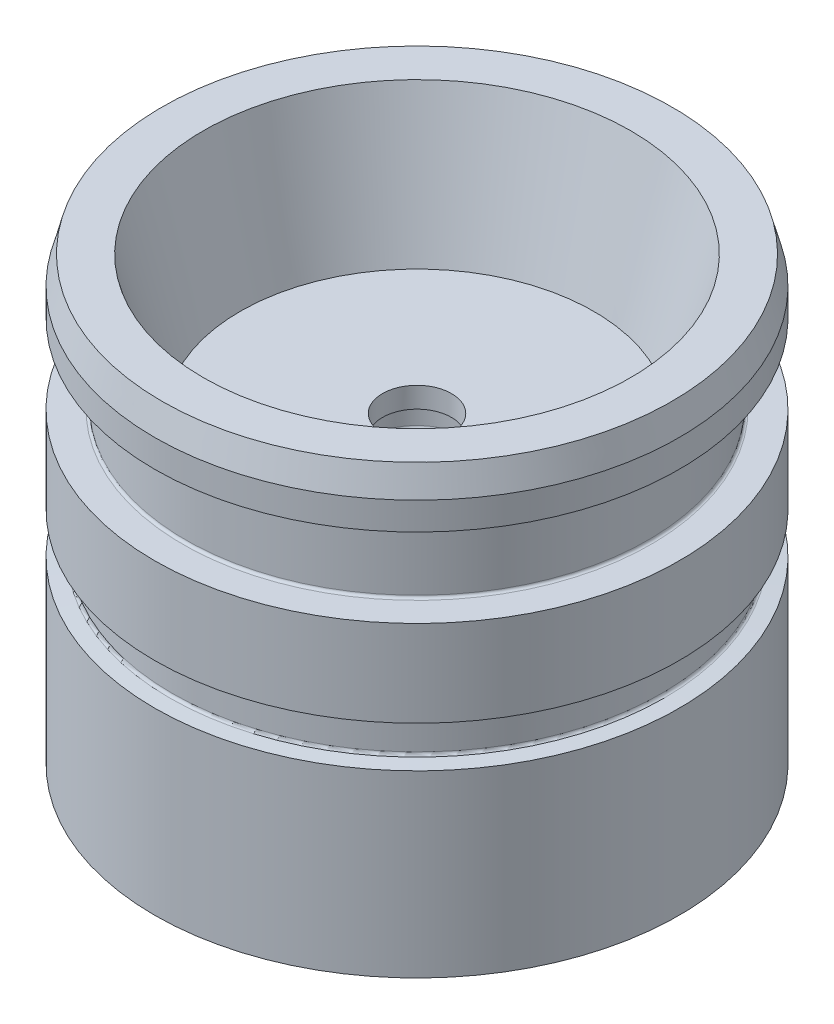
ISO-10303-21;
HEADER;
FILE_DESCRIPTION(('STEP AP214'),'2;1');
FILE_NAME('part.step','',(''),(''),'','','');
FILE_SCHEMA(('AUTOMOTIVE_DESIGN { 1 0 10303 214 1 1 1 1 }'));
ENDSEC;
DATA;
#1=APPLICATION_CONTEXT('core data for automotive mechanical design processes');
#2=APPLICATION_PROTOCOL_DEFINITION('international standard','automotive_design',2000,#1);
#3=PRODUCT_CONTEXT('',#1,'mechanical');
#4=PRODUCT('Part','Part','',(#3));
#5=PRODUCT_RELATED_PRODUCT_CATEGORY('part','',(#4));
#6=PRODUCT_DEFINITION_FORMATION('','',#4);
#7=PRODUCT_DEFINITION_CONTEXT('part definition',#1,'design');
#8=PRODUCT_DEFINITION('design','',#6,#7);
#9=PRODUCT_DEFINITION_SHAPE('','',#8);
#10=(LENGTH_UNIT() NAMED_UNIT(*) SI_UNIT(.MILLI.,.METRE.));
#11=(NAMED_UNIT(*) PLANE_ANGLE_UNIT() SI_UNIT($,.RADIAN.));
#12=(NAMED_UNIT(*) SI_UNIT($,.STERADIAN.) SOLID_ANGLE_UNIT());
#13=UNCERTAINTY_MEASURE_WITH_UNIT(LENGTH_MEASURE(1.E-05),#10,'distance_accuracy_value','');
#14=(GEOMETRIC_REPRESENTATION_CONTEXT(3) GLOBAL_UNCERTAINTY_ASSIGNED_CONTEXT((#13)) GLOBAL_UNIT_ASSIGNED_CONTEXT((#10,
#11,#12)) REPRESENTATION_CONTEXT('',''));
#15=CARTESIAN_POINT('',(0.,0.,0.));
#16=DIRECTION('',(0.,0.,1.));
#17=DIRECTION('',(1.,0.,0.));
#18=AXIS2_PLACEMENT_3D('',#15,#16,#17);
#19=CARTESIAN_POINT('',(0.,12.7,0.));
#20=DIRECTION('',(0.,1.,0.));
#21=DIRECTION('',(0.,0.,1.));
#22=AXIS2_PLACEMENT_3D('',#19,#20,#21);
#23=CYLINDRICAL_SURFACE('',#22,3.17499999999999);
#24=CARTESIAN_POINT('',(0.,10.796925267563,0.));
#25=DIRECTION('',(0.,-1.,0.));
#26=DIRECTION('',(0.,0.,-1.));
#27=AXIS2_PLACEMENT_3D('',#24,#25,#26);
#28=CIRCLE('',#27,3.17499999999999);
#29=CARTESIAN_POINT('',(0.,10.796925267563,-3.17499999999999));
#30=VERTEX_POINT('',#29);
#31=EDGE_CURVE('E66',#30,#30,#28,.T.);
#32=ORIENTED_EDGE('',*,*,#31,.T.);
#33=EDGE_LOOP('',(#32));
#34=FACE_BOUND('',#33,.T.);
#35=CARTESIAN_POINT('',(0.,12.7,0.));
#36=DIRECTION('',(0.,1.,0.));
#37=DIRECTION('',(0.,0.,1.));
#38=AXIS2_PLACEMENT_3D('',#35,#36,#37);
#39=CIRCLE('',#38,3.17499999999999);
#40=CARTESIAN_POINT('',(0.,12.7,3.17499999999999));
#41=VERTEX_POINT('',#40);
#42=EDGE_CURVE('E62',#41,#41,#39,.T.);
#43=ORIENTED_EDGE('',*,*,#42,.T.);
#44=EDGE_LOOP('',(#43));
#45=FACE_BOUND('',#44,.T.);
#46=ADVANCED_FACE('F37',(#34,#45),#23,.F.);
#47=CARTESIAN_POINT('',(0.,25.4,0.));
#48=DIRECTION('',(0.,-1.,0.));
#49=DIRECTION('',(0.,0.,-1.));
#50=AXIS2_PLACEMENT_3D('',#47,#48,#49);
#51=CYLINDRICAL_SURFACE('',#50,24.1554);
#52=CARTESIAN_POINT('',(0.,5.07382513028604,0.));
#53=DIRECTION('',(0.,1.,0.));
#54=DIRECTION('',(0.,0.,1.));
#55=AXIS2_PLACEMENT_3D('',#52,#53,#54);
#56=CIRCLE('',#55,24.1554);
#57=CARTESIAN_POINT('',(0.,5.07382513028604,24.1554));
#58=VERTEX_POINT('',#57);
#59=EDGE_CURVE('E71',#58,#58,#56,.T.);
#60=ORIENTED_EDGE('',*,*,#59,.T.);
#61=EDGE_LOOP('',(#60));
#62=FACE_BOUND('',#61,.T.);
#63=CARTESIAN_POINT('',(0.,13.0302,0.));
#64=DIRECTION('',(0.,-1.,0.));
#65=DIRECTION('',(0.,0.,-1.));
#66=AXIS2_PLACEMENT_3D('',#63,#64,#65);
#67=CIRCLE('',#66,24.1554);
#68=CARTESIAN_POINT('',(0.,13.0302,-24.1554));
#69=VERTEX_POINT('',#68);
#70=EDGE_CURVE('E109',#69,#69,#67,.T.);
#71=ORIENTED_EDGE('',*,*,#70,.T.);
#72=EDGE_LOOP('',(#71));
#73=FACE_BOUND('',#72,.T.);
#74=ADVANCED_FACE('F150',(#62,#73),#51,.T.);
#75=CARTESIAN_POINT('',(0.,22.8599999999999,0.));
#76=DIRECTION('',(0.,1.,0.));
#77=DIRECTION('',(0.,0.,1.));
#78=AXIS2_PLACEMENT_3D('',#75,#76,#77);
#79=CIRCLE('',#78,24.1554);
#80=CARTESIAN_POINT('',(0.,22.8599999999999,24.1554));
#81=VERTEX_POINT('',#80);
#82=EDGE_CURVE('E51',#81,#81,#79,.F.);
#83=ORIENTED_EDGE('',*,*,#82,.T.);
#84=EDGE_LOOP('',(#83));
#85=FACE_BOUND('',#84,.T.);
#86=CARTESIAN_POINT('',(0.,20.32,0.));
#87=DIRECTION('',(0.,-1.,0.));
#88=DIRECTION('',(0.,0.,-1.));
#89=AXIS2_PLACEMENT_3D('',#86,#87,#88);
#90=CIRCLE('',#89,24.1554);
#91=CARTESIAN_POINT('',(0.,20.32,-24.1554));
#92=VERTEX_POINT('',#91);
#93=EDGE_CURVE('E106',#92,#92,#90,.T.);
#94=ORIENTED_EDGE('',*,*,#93,.F.);
#95=EDGE_LOOP('',(#94));
#96=FACE_BOUND('',#95,.T.);
#97=ADVANCED_FACE('F129',(#85,#96),#51,.T.);
#98=CARTESIAN_POINT('',(0.,25.4,0.));
#99=DIRECTION('',(0.,1.,0.));
#100=DIRECTION('',(0.,0.,1.));
#101=AXIS2_PLACEMENT_3D('',#98,#99,#100);
#102=PLANE('',#101);
#103=CARTESIAN_POINT('',(0.,25.4,0.));
#104=DIRECTION('',(0.,1.,0.));
#105=DIRECTION('',(0.,0.,1.));
#106=AXIS2_PLACEMENT_3D('',#103,#104,#105);
#107=CIRCLE('',#106,19.6850000000001);
#108=CARTESIAN_POINT('',(0.,25.4,19.6850000000001));
#109=VERTEX_POINT('',#108);
#110=EDGE_CURVE('E46',#109,#109,#107,.F.);
#111=ORIENTED_EDGE('',*,*,#110,.T.);
#112=EDGE_LOOP('',(#111));
#113=FACE_BOUND('',#112,.T.);
#114=CARTESIAN_POINT('',(0.,25.4,0.));
#115=DIRECTION('',(0.,1.,0.));
#116=DIRECTION('',(0.,0.,1.));
#117=AXIS2_PLACEMENT_3D('',#114,#115,#116);
#118=CIRCLE('',#117,23.4748090512249);
#119=CARTESIAN_POINT('',(0.,25.4,23.4748090512249));
#120=VERTEX_POINT('',#119);
#121=EDGE_CURVE('E124',#120,#120,#118,.T.);
#122=ORIENTED_EDGE('',*,*,#121,.T.);
#123=EDGE_LOOP('',(#122));
#124=FACE_BOUND('',#123,.T.);
#125=ADVANCED_FACE('F138',(#113,#124),#102,.T.);
#126=CARTESIAN_POINT('',(0.,12.7,0.));
#127=DIRECTION('',(0.,1.,0.));
#128=DIRECTION('',(0.,0.,1.));
#129=AXIS2_PLACEMENT_3D('',#126,#127,#128);
#130=PLANE('',#129);
#131=ORIENTED_EDGE('',*,*,#42,.F.);
#132=EDGE_LOOP('',(#131));
#133=FACE_BOUND('',#132,.T.);
#134=CARTESIAN_POINT('',(0.,12.7,0.));
#135=DIRECTION('',(0.,1.,0.));
#136=DIRECTION('',(0.,0.,1.));
#137=AXIS2_PLACEMENT_3D('',#134,#135,#136);
#138=CIRCLE('',#137,16.2820452561249);
#139=CARTESIAN_POINT('',(0.,12.7,16.2820452561249));
#140=VERTEX_POINT('',#139);
#141=EDGE_CURVE('E10',#140,#140,#138,.T.);
#142=ORIENTED_EDGE('',*,*,#141,.T.);
#143=EDGE_LOOP('',(#142));
#144=FACE_BOUND('',#143,.T.);
#145=ADVANCED_FACE('F140',(#133,#144),#130,.T.);
#146=CARTESIAN_POINT('',(-24.1554,20.32,0.));
#147=DIRECTION('',(0.,-1.,0.));
#148=DIRECTION('',(0.,0.,-1.));
#149=AXIS2_PLACEMENT_3D('',#146,#147,#148);
#150=PLANE('',#149);
#151=ORIENTED_EDGE('',*,*,#93,.T.);
#152=EDGE_LOOP('',(#151));
#153=FACE_BOUND('',#152,.T.);
#154=CARTESIAN_POINT('',(0.,20.32,0.));
#155=DIRECTION('',(0.,-1.,0.));
#156=DIRECTION('',(0.,0.,-1.));
#157=AXIS2_PLACEMENT_3D('',#154,#155,#156);
#158=CIRCLE('',#157,21.5508123847554);
#159=CARTESIAN_POINT('',(0.,20.32,-21.5508123847554));
#160=VERTEX_POINT('',#159);
#161=EDGE_CURVE('E121',#160,#160,#158,.T.);
#162=ORIENTED_EDGE('',*,*,#161,.F.);
#163=EDGE_LOOP('',(#162));
#164=FACE_BOUND('',#163,.T.);
#165=ADVANCED_FACE('F147',(#153,#164),#150,.T.);
#166=CARTESIAN_POINT('',(0.,20.0797876152446,0.));
#167=DIRECTION('',(0.,-1.,0.));
#168=DIRECTION('',(0.,0.,-1.));
#169=AXIS2_PLACEMENT_3D('',#166,#167,#168);
#170=TOROIDAL_SURFACE('',#169,21.5508123847554,0.240212384755438);
#171=ORIENTED_EDGE('',*,*,#161,.T.);
#172=EDGE_LOOP('',(#171));
#173=FACE_BOUND('',#172,.T.);
#174=CARTESIAN_POINT('',(0.,20.0797876152446,0.));
#175=DIRECTION('',(0.,-1.,0.));
#176=DIRECTION('',(0.,0.,-1.));
#177=AXIS2_PLACEMENT_3D('',#174,#175,#176);
#178=CIRCLE('',#177,21.3106);
#179=CARTESIAN_POINT('',(0.,20.0797876152446,-21.3106));
#180=VERTEX_POINT('',#179);
#181=EDGE_CURVE('E118',#180,#180,#178,.T.);
#182=ORIENTED_EDGE('',*,*,#181,.F.);
#183=EDGE_LOOP('',(#182));
#184=FACE_BOUND('',#183,.T.);
#185=ADVANCED_FACE('F455',(#173,#184),#170,.F.);
#186=CARTESIAN_POINT('',(0.,0.,0.));
#187=DIRECTION('',(0.,-1.,0.));
#188=DIRECTION('',(0.,0.,-1.));
#189=AXIS2_PLACEMENT_3D('',#186,#187,#188);
#190=CYLINDRICAL_SURFACE('',#189,21.3106);
#191=ORIENTED_EDGE('',*,*,#181,.T.);
#192=EDGE_LOOP('',(#191));
#193=FACE_BOUND('',#192,.T.);
#194=CARTESIAN_POINT('',(0.,13.2704123847554,0.));
#195=DIRECTION('',(0.,-1.,0.));
#196=DIRECTION('',(0.,0.,-1.));
#197=AXIS2_PLACEMENT_3D('',#194,#195,#196);
#198=CIRCLE('',#197,21.3106);
#199=CARTESIAN_POINT('',(0.,13.2704123847554,-21.3106));
#200=VERTEX_POINT('',#199);
#201=EDGE_CURVE('E115',#200,#200,#198,.T.);
#202=ORIENTED_EDGE('',*,*,#201,.F.);
#203=EDGE_LOOP('',(#202));
#204=FACE_BOUND('',#203,.T.);
#205=ADVANCED_FACE('F447',(#193,#204),#190,.T.);
#206=CARTESIAN_POINT('',(0.,13.2704123847554,0.));
#207=DIRECTION('',(0.,-1.,0.));
#208=DIRECTION('',(0.,0.,-1.));
#209=AXIS2_PLACEMENT_3D('',#206,#207,#208);
#210=TOROIDAL_SURFACE('',#209,21.5508123847554,0.240212384755436);
#211=ORIENTED_EDGE('',*,*,#201,.T.);
#212=EDGE_LOOP('',(#211));
#213=FACE_BOUND('',#212,.T.);
#214=CARTESIAN_POINT('',(0.,13.0302,0.));
#215=DIRECTION('',(0.,-1.,0.));
#216=DIRECTION('',(0.,0.,-1.));
#217=AXIS2_PLACEMENT_3D('',#214,#215,#216);
#218=CIRCLE('',#217,21.5508123847554);
#219=CARTESIAN_POINT('',(0.,13.0302,-21.5508123847554));
#220=VERTEX_POINT('',#219);
#221=EDGE_CURVE('E112',#220,#220,#218,.T.);
#222=ORIENTED_EDGE('',*,*,#221,.F.);
#223=EDGE_LOOP('',(#222));
#224=FACE_BOUND('',#223,.T.);
#225=ADVANCED_FACE('F440',(#213,#224),#210,.F.);
#226=CARTESIAN_POINT('',(-21.5508123847554,13.0302,0.));
#227=DIRECTION('',(0.,1.,0.));
#228=DIRECTION('',(0.,0.,1.));
#229=AXIS2_PLACEMENT_3D('',#226,#227,#228);
#230=PLANE('',#229);
#231=ORIENTED_EDGE('',*,*,#221,.T.);
#232=EDGE_LOOP('',(#231));
#233=FACE_BOUND('',#232,.T.);
#234=ORIENTED_EDGE('',*,*,#70,.F.);
#235=EDGE_LOOP('',(#234));
#236=FACE_BOUND('',#235,.T.);
#237=ADVANCED_FACE('F135',(#233,#236),#230,.T.);
#238=CARTESIAN_POINT('',(0.,25.4,0.));
#239=DIRECTION('',(0.,-1.,0.));
#240=DIRECTION('',(0.,0.,-1.));
#241=AXIS2_PLACEMENT_3D('',#238,#239,#240);
#242=CONICAL_SURFACE('',#241,23.4748090512249,0.261799387799144);
#243=ORIENTED_EDGE('',*,*,#82,.F.);
#244=EDGE_LOOP('',(#243));
#245=FACE_BOUND('',#244,.T.);
#246=ORIENTED_EDGE('',*,*,#121,.F.);
#247=EDGE_LOOP('',(#246));
#248=FACE_BOUND('',#247,.T.);
#249=ADVANCED_FACE('F132',(#245,#248),#242,.T.);
#250=CARTESIAN_POINT('',(0.,11.180886423162,0.));
#251=DIRECTION('',(0.,1.,0.));
#252=DIRECTION('',(0.,0.,1.));
#253=AXIS2_PLACEMENT_3D('',#250,#251,#252);
#254=CONICAL_SURFACE('',#253,15.875,0.261799387799146);
#255=ORIENTED_EDGE('',*,*,#110,.F.);
#256=EDGE_LOOP('',(#255));
#257=FACE_BOUND('',#256,.T.);
#258=ORIENTED_EDGE('',*,*,#141,.F.);
#259=EDGE_LOOP('',(#258));
#260=FACE_BOUND('',#259,.T.);
#261=ADVANCED_FACE('F40',(#257,#260),#254,.F.);
#262=CARTESIAN_POINT('',(0.,10.7061,0.));
#263=DIRECTION('',(0.,-1.,0.));
#264=DIRECTION('',(0.,0.,-1.));
#265=AXIS2_PLACEMENT_3D('',#262,#263,#264);
#266=CONICAL_SURFACE('',#265,4.2131375586579,1.48352986419518);
#267=CARTESIAN_POINT('',(0.,10.7061,0.));
#268=DIRECTION('',(0.,-1.,0.));
#269=DIRECTION('',(0.,0.,-1.));
#270=AXIS2_PLACEMENT_3D('',#267,#268,#269);
#271=CIRCLE('',#270,4.2131375586579);
#272=CARTESIAN_POINT('',(0.,10.7061,-4.2131375586579));
#273=VERTEX_POINT('',#272);
#274=EDGE_CURVE('E67',#273,#273,#271,.T.);
#275=ORIENTED_EDGE('',*,*,#274,.T.);
#276=EDGE_LOOP('',(#275));
#277=FACE_BOUND('',#276,.T.);
#278=ORIENTED_EDGE('',*,*,#31,.F.);
#279=EDGE_LOOP('',(#278));
#280=FACE_BOUND('',#279,.T.);
#281=ADVANCED_FACE('F236',(#277,#280),#266,.F.);
#282=CARTESIAN_POINT('',(0.,8.2452969902495,0.));
#283=DIRECTION('',(0.,1.,0.));
#284=DIRECTION('',(0.,0.,1.));
#285=AXIS2_PLACEMENT_3D('',#282,#283,#284);
#286=CONICAL_SURFACE('',#285,3.0861,1.48352986419518);
#287=CARTESIAN_POINT('',(0.,8.3439,0.));
#288=DIRECTION('',(0.,-1.,0.));
#289=DIRECTION('',(0.,0.,-1.));
#290=AXIS2_PLACEMENT_3D('',#287,#288,#289);
#291=CIRCLE('',#290,4.2131375586579);
#292=CARTESIAN_POINT('',(0.,8.3439,-4.2131375586579));
#293=VERTEX_POINT('',#292);
#294=EDGE_CURVE('E85',#293,#293,#291,.T.);
#295=ORIENTED_EDGE('',*,*,#294,.F.);
#296=EDGE_LOOP('',(#295));
#297=FACE_BOUND('',#296,.T.);
#298=CARTESIAN_POINT('',(0.,8.25307473243695,0.));
#299=DIRECTION('',(0.,1.,0.));
#300=DIRECTION('',(0.,0.,1.));
#301=AXIS2_PLACEMENT_3D('',#298,#299,#300);
#302=CIRCLE('',#301,3.17499999999999);
#303=CARTESIAN_POINT('',(0.,8.25307473243695,3.17499999999999));
#304=VERTEX_POINT('',#303);
#305=EDGE_CURVE('E63',#304,#304,#302,.T.);
#306=ORIENTED_EDGE('',*,*,#305,.F.);
#307=EDGE_LOOP('',(#306));
#308=FACE_BOUND('',#307,.T.);
#309=ADVANCED_FACE('F233',(#297,#308),#286,.F.);
#310=CARTESIAN_POINT('',(0.,10.4530665466847,0.));
#311=DIRECTION('',(0.,-1.,0.));
#312=DIRECTION('',(0.,0.,-1.));
#313=AXIS2_PLACEMENT_3D('',#310,#311,#312);
#314=TOROIDAL_SURFACE('',#313,4.191,0.254000000000001);
#315=ORIENTED_EDGE('',*,*,#274,.F.);
#316=EDGE_LOOP('',(#315));
#317=FACE_BOUND('',#316,.T.);
#318=CARTESIAN_POINT('',(0.,10.4530665466847,0.));
#319=DIRECTION('',(0.,-1.,0.));
#320=DIRECTION('',(0.,0.,-1.));
#321=AXIS2_PLACEMENT_3D('',#318,#319,#320);
#322=CIRCLE('',#321,4.445);
#323=CARTESIAN_POINT('',(0.,10.4530665466847,-4.445));
#324=VERTEX_POINT('',#323);
#325=EDGE_CURVE('E76',#324,#324,#322,.T.);
#326=ORIENTED_EDGE('',*,*,#325,.T.);
#327=EDGE_LOOP('',(#326));
#328=FACE_BOUND('',#327,.T.);
#329=ADVANCED_FACE('F231',(#317,#328),#314,.F.);
#330=CARTESIAN_POINT('',(0.,8.5969334533153,0.));
#331=DIRECTION('',(0.,-1.,0.));
#332=DIRECTION('',(0.,0.,-1.));
#333=AXIS2_PLACEMENT_3D('',#330,#331,#332);
#334=TOROIDAL_SURFACE('',#333,4.191,0.253999999999999);
#335=CARTESIAN_POINT('',(0.,8.5969334533153,0.));
#336=DIRECTION('',(0.,-1.,0.));
#337=DIRECTION('',(0.,0.,-1.));
#338=AXIS2_PLACEMENT_3D('',#335,#336,#337);
#339=CIRCLE('',#338,4.445);
#340=CARTESIAN_POINT('',(0.,8.5969334533153,-4.445));
#341=VERTEX_POINT('',#340);
#342=EDGE_CURVE('E80',#341,#341,#339,.T.);
#343=ORIENTED_EDGE('',*,*,#342,.F.);
#344=EDGE_LOOP('',(#343));
#345=FACE_BOUND('',#344,.T.);
#346=ORIENTED_EDGE('',*,*,#294,.T.);
#347=EDGE_LOOP('',(#346));
#348=FACE_BOUND('',#347,.T.);
#349=ADVANCED_FACE('F180',(#345,#348),#334,.F.);
#350=CARTESIAN_POINT('',(0.,62.7,0.));
#351=DIRECTION('',(0.,-1.,0.));
#352=DIRECTION('',(0.,0.,-1.));
#353=AXIS2_PLACEMENT_3D('',#350,#351,#352);
#354=CYLINDRICAL_SURFACE('',#353,4.445);
#355=ORIENTED_EDGE('',*,*,#325,.F.);
#356=EDGE_LOOP('',(#355));
#357=FACE_BOUND('',#356,.T.);
#358=ORIENTED_EDGE('',*,*,#342,.T.);
#359=EDGE_LOOP('',(#358));
#360=FACE_BOUND('',#359,.T.);
#361=ADVANCED_FACE('F171',(#357,#360),#354,.F.);
#362=CARTESIAN_POINT('',(0.,0.0407816706828649,0.));
#363=DIRECTION('',(0.,-1.,0.));
#364=DIRECTION('',(1.,0.,0.));
#365=AXIS2_PLACEMENT_3D('',#362,#363,#364);
#366=CIRCLE('',#365,3.17499999999999);
#367=CARTESIAN_POINT('',(3.17499999999999,0.0407816706828652,0.));
#368=VERTEX_POINT('',#367);
#369=EDGE_CURVE('E42',#368,#368,#366,.T.);
#370=ORIENTED_EDGE('',*,*,#369,.T.);
#371=EDGE_LOOP('',(#370));
#372=FACE_BOUND('',#371,.T.);
#373=CARTESIAN_POINT('',(0.,1.26807473243695,0.));
#374=DIRECTION('',(0.,1.,0.));
#375=DIRECTION('',(0.,0.,1.));
#376=AXIS2_PLACEMENT_3D('',#373,#374,#375);
#377=CIRCLE('',#376,3.17499999999999);
#378=CARTESIAN_POINT('',(0.,1.26807473243695,3.17499999999999));
#379=VERTEX_POINT('',#378);
#380=EDGE_CURVE('E55',#379,#379,#377,.T.);
#381=ORIENTED_EDGE('',*,*,#380,.T.);
#382=EDGE_LOOP('',(#381));
#383=FACE_BOUND('',#382,.T.);
#384=ADVANCED_FACE('F157',(#372,#383),#23,.F.);
#385=CARTESIAN_POINT('',(0.,1.26029699024949,0.));
#386=DIRECTION('',(0.,1.,0.));
#387=DIRECTION('',(0.,0.,1.));
#388=AXIS2_PLACEMENT_3D('',#385,#386,#387);
#389=CONICAL_SURFACE('',#388,3.0861,1.48352986419518);
#390=CARTESIAN_POINT('',(0.,1.3589,0.));
#391=DIRECTION('',(0.,-1.,0.));
#392=DIRECTION('',(0.,0.,-1.));
#393=AXIS2_PLACEMENT_3D('',#390,#391,#392);
#394=CIRCLE('',#393,4.2131375586579);
#395=CARTESIAN_POINT('',(0.,1.3589,-4.2131375586579));
#396=VERTEX_POINT('',#395);
#397=EDGE_CURVE('E99',#396,#396,#394,.T.);
#398=ORIENTED_EDGE('',*,*,#397,.F.);
#399=EDGE_LOOP('',(#398));
#400=FACE_BOUND('',#399,.T.);
#401=ORIENTED_EDGE('',*,*,#380,.F.);
#402=EDGE_LOOP('',(#401));
#403=FACE_BOUND('',#402,.T.);
#404=ADVANCED_FACE('F170',(#400,#403),#389,.F.);
#405=CARTESIAN_POINT('',(0.,1.6119334533153,0.));
#406=DIRECTION('',(0.,-1.,0.));
#407=DIRECTION('',(0.,0.,-1.));
#408=AXIS2_PLACEMENT_3D('',#405,#406,#407);
#409=TOROIDAL_SURFACE('',#408,4.191,0.254000000000001);
#410=CARTESIAN_POINT('',(0.,1.6119334533153,0.));
#411=DIRECTION('',(0.,-1.,0.));
#412=DIRECTION('',(0.,0.,-1.));
#413=AXIS2_PLACEMENT_3D('',#410,#411,#412);
#414=CIRCLE('',#413,4.445);
#415=CARTESIAN_POINT('',(0.,1.6119334533153,-4.445));
#416=VERTEX_POINT('',#415);
#417=EDGE_CURVE('E96',#416,#416,#414,.T.);
#418=ORIENTED_EDGE('',*,*,#417,.F.);
#419=EDGE_LOOP('',(#418));
#420=FACE_BOUND('',#419,.T.);
#421=ORIENTED_EDGE('',*,*,#397,.T.);
#422=EDGE_LOOP('',(#421));
#423=FACE_BOUND('',#422,.T.);
#424=ADVANCED_FACE('F177',(#420,#423),#409,.F.);
#425=CARTESIAN_POINT('',(0.,62.7,0.));
#426=DIRECTION('',(0.,-1.,0.));
#427=DIRECTION('',(0.,0.,-1.));
#428=AXIS2_PLACEMENT_3D('',#425,#426,#427);
#429=CYLINDRICAL_SURFACE('',#428,4.445);
#430=CARTESIAN_POINT('',(0.,3.4680665466847,0.));
#431=DIRECTION('',(0.,-1.,0.));
#432=DIRECTION('',(0.,0.,-1.));
#433=AXIS2_PLACEMENT_3D('',#430,#431,#432);
#434=CIRCLE('',#433,4.445);
#435=CARTESIAN_POINT('',(0.,3.4680665466847,-4.445));
#436=VERTEX_POINT('',#435);
#437=EDGE_CURVE('E70',#436,#436,#434,.T.);
#438=ORIENTED_EDGE('',*,*,#437,.F.);
#439=EDGE_LOOP('',(#438));
#440=FACE_BOUND('',#439,.T.);
#441=ORIENTED_EDGE('',*,*,#417,.T.);
#442=EDGE_LOOP('',(#441));
#443=FACE_BOUND('',#442,.T.);
#444=ADVANCED_FACE('F244',(#440,#443),#429,.F.);
#445=CARTESIAN_POINT('',(0.,3.46806654668469,0.));
#446=DIRECTION('',(0.,-1.,0.));
#447=DIRECTION('',(0.,0.,-1.));
#448=AXIS2_PLACEMENT_3D('',#445,#446,#447);
#449=TOROIDAL_SURFACE('',#448,4.191,0.254000000000001);
#450=CARTESIAN_POINT('',(0.,3.7211,0.));
#451=DIRECTION('',(0.,-1.,0.));
#452=DIRECTION('',(0.,0.,-1.));
#453=AXIS2_PLACEMENT_3D('',#450,#451,#452);
#454=CIRCLE('',#453,4.2131375586579);
#455=CARTESIAN_POINT('',(0.,3.7211,-4.2131375586579));
#456=VERTEX_POINT('',#455);
#457=EDGE_CURVE('E59',#456,#456,#454,.T.);
#458=ORIENTED_EDGE('',*,*,#457,.F.);
#459=EDGE_LOOP('',(#458));
#460=FACE_BOUND('',#459,.T.);
#461=ORIENTED_EDGE('',*,*,#437,.T.);
#462=EDGE_LOOP('',(#461));
#463=FACE_BOUND('',#462,.T.);
#464=ADVANCED_FACE('F247',(#460,#463),#449,.F.);
#465=CARTESIAN_POINT('',(0.,3.7211,0.));
#466=DIRECTION('',(0.,-1.,0.));
#467=DIRECTION('',(0.,0.,-1.));
#468=AXIS2_PLACEMENT_3D('',#465,#466,#467);
#469=CONICAL_SURFACE('',#468,4.2131375586579,1.48352986419518);
#470=ORIENTED_EDGE('',*,*,#457,.T.);
#471=EDGE_LOOP('',(#470));
#472=FACE_BOUND('',#471,.T.);
#473=CARTESIAN_POINT('',(0.,3.81192526756305,0.));
#474=DIRECTION('',(0.,-1.,0.));
#475=DIRECTION('',(0.,0.,-1.));
#476=AXIS2_PLACEMENT_3D('',#473,#474,#475);
#477=CIRCLE('',#476,3.17499999999999);
#478=CARTESIAN_POINT('',(0.,3.81192526756305,-3.17499999999999));
#479=VERTEX_POINT('',#478);
#480=EDGE_CURVE('E58',#479,#479,#477,.T.);
#481=ORIENTED_EDGE('',*,*,#480,.F.);
#482=EDGE_LOOP('',(#481));
#483=FACE_BOUND('',#482,.T.);
#484=ADVANCED_FACE('F167',(#472,#483),#469,.F.);
#485=ORIENTED_EDGE('',*,*,#305,.T.);
#486=EDGE_LOOP('',(#485));
#487=FACE_BOUND('',#486,.T.);
#488=ORIENTED_EDGE('',*,*,#480,.T.);
#489=EDGE_LOOP('',(#488));
#490=FACE_BOUND('',#489,.T.);
#491=ADVANCED_FACE('F156',(#487,#490),#23,.F.);
#492=CARTESIAN_POINT('',(0.,1.22950841658921,0.));
#493=DIRECTION('',(0.,-1.,0.));
#494=DIRECTION('',(0.,0.,-1.));
#495=AXIS2_PLACEMENT_3D('',#492,#493,#494);
#496=CONICAL_SURFACE('',#495,24.6888,1.48352986419518);
#497=CARTESIAN_POINT('',(0.,1.39700000000002,0.));
#498=DIRECTION('',(0.,1.,0.));
#499=DIRECTION('',(0.,0.,1.));
#500=AXIS2_PLACEMENT_3D('',#497,#498,#499);
#501=CIRCLE('',#500,22.7743624413421);
#502=CARTESIAN_POINT('',(0.,1.39700000000002,22.7743624413421));
#503=VERTEX_POINT('',#502);
#504=EDGE_CURVE('E74',#503,#503,#501,.T.);
#505=ORIENTED_EDGE('',*,*,#504,.F.);
#506=EDGE_LOOP('',(#505));
#507=FACE_BOUND('',#506,.T.);
#508=CARTESIAN_POINT('',(0.,1.27617486971394,0.));
#509=DIRECTION('',(0.,-1.,0.));
#510=DIRECTION('',(0.,0.,-1.));
#511=AXIS2_PLACEMENT_3D('',#508,#509,#510);
#512=CIRCLE('',#511,24.1554);
#513=CARTESIAN_POINT('',(0.,1.27617486971394,-24.1554));
#514=VERTEX_POINT('',#513);
#515=EDGE_CURVE('E73',#514,#514,#512,.T.);
#516=ORIENTED_EDGE('',*,*,#515,.F.);
#517=EDGE_LOOP('',(#516));
#518=FACE_BOUND('',#517,.T.);
#519=ADVANCED_FACE('F166',(#507,#518),#496,.T.);
#520=CARTESIAN_POINT('',(0.,4.95299999999996,0.));
#521=DIRECTION('',(0.,1.,0.));
#522=DIRECTION('',(0.,0.,1.));
#523=AXIS2_PLACEMENT_3D('',#520,#521,#522);
#524=CONICAL_SURFACE('',#523,22.7743624413421,1.48352986419518);
#525=CARTESIAN_POINT('',(0.,4.95299999999996,0.));
#526=DIRECTION('',(0.,1.,0.));
#527=DIRECTION('',(0.,0.,1.));
#528=AXIS2_PLACEMENT_3D('',#525,#526,#527);
#529=CIRCLE('',#528,22.7743624413421);
#530=CARTESIAN_POINT('',(0.,4.95299999999996,22.7743624413421));
#531=VERTEX_POINT('',#530);
#532=EDGE_CURVE('E206',#531,#531,#529,.T.);
#533=ORIENTED_EDGE('',*,*,#532,.T.);
#534=EDGE_LOOP('',(#533));
#535=FACE_BOUND('',#534,.T.);
#536=ORIENTED_EDGE('',*,*,#59,.F.);
#537=EDGE_LOOP('',(#536));
#538=FACE_BOUND('',#537,.T.);
#539=ADVANCED_FACE('F217',(#535,#538),#524,.T.);
#540=CARTESIAN_POINT('',(0.,1.65003345331532,0.));
#541=DIRECTION('',(0.,1.,0.));
#542=DIRECTION('',(0.,0.,1.));
#543=AXIS2_PLACEMENT_3D('',#540,#541,#542);
#544=TOROIDAL_SURFACE('',#543,22.7965,0.254000000000001);
#545=CARTESIAN_POINT('',(0.,1.65003345331532,0.));
#546=DIRECTION('',(0.,1.,0.));
#547=DIRECTION('',(0.,0.,1.));
#548=AXIS2_PLACEMENT_3D('',#545,#546,#547);
#549=CIRCLE('',#548,22.5425);
#550=CARTESIAN_POINT('',(0.,1.65003345331532,22.5425));
#551=VERTEX_POINT('',#550);
#552=EDGE_CURVE('E201',#551,#551,#549,.T.);
#553=ORIENTED_EDGE('',*,*,#552,.F.);
#554=EDGE_LOOP('',(#553));
#555=FACE_BOUND('',#554,.T.);
#556=ORIENTED_EDGE('',*,*,#504,.T.);
#557=EDGE_LOOP('',(#556));
#558=FACE_BOUND('',#557,.T.);
#559=ADVANCED_FACE('F213',(#555,#558),#544,.F.);
#560=CARTESIAN_POINT('',(0.,4.69996654668466,0.));
#561=DIRECTION('',(0.,1.,0.));
#562=DIRECTION('',(0.,0.,1.));
#563=AXIS2_PLACEMENT_3D('',#560,#561,#562);
#564=TOROIDAL_SURFACE('',#563,22.7965,0.253999999999998);
#565=ORIENTED_EDGE('',*,*,#532,.F.);
#566=EDGE_LOOP('',(#565));
#567=FACE_BOUND('',#566,.T.);
#568=CARTESIAN_POINT('',(0.,4.69996654668466,0.));
#569=DIRECTION('',(0.,1.,0.));
#570=DIRECTION('',(0.,0.,1.));
#571=AXIS2_PLACEMENT_3D('',#568,#569,#570);
#572=CIRCLE('',#571,22.5425);
#573=CARTESIAN_POINT('',(0.,4.69996654668466,22.5425));
#574=VERTEX_POINT('',#573);
#575=EDGE_CURVE('E204',#574,#574,#572,.T.);
#576=ORIENTED_EDGE('',*,*,#575,.T.);
#577=EDGE_LOOP('',(#576));
#578=FACE_BOUND('',#577,.T.);
#579=ADVANCED_FACE('F226',(#567,#578),#564,.F.);
#580=CARTESIAN_POINT('',(0.,-24.6,0.));
#581=DIRECTION('',(0.,1.,0.));
#582=DIRECTION('',(0.,0.,1.));
#583=AXIS2_PLACEMENT_3D('',#580,#581,#582);
#584=CYLINDRICAL_SURFACE('',#583,22.5425);
#585=ORIENTED_EDGE('',*,*,#575,.F.);
#586=EDGE_LOOP('',(#585));
#587=FACE_BOUND('',#586,.T.);
#588=ORIENTED_EDGE('',*,*,#552,.T.);
#589=EDGE_LOOP('',(#588));
#590=FACE_BOUND('',#589,.T.);
#591=ADVANCED_FACE('F319',(#587,#590),#584,.T.);
#592=ORIENTED_EDGE('',*,*,#515,.T.);
#593=EDGE_LOOP('',(#592));
#594=FACE_BOUND('',#593,.T.);
#595=CARTESIAN_POINT('',(0.,-15.24,0.));
#596=DIRECTION('',(0.,-1.,0.));
#597=DIRECTION('',(0.,0.,-1.));
#598=AXIS2_PLACEMENT_3D('',#595,#596,#597);
#599=CIRCLE('',#598,24.1554);
#600=CARTESIAN_POINT('',(0.,-15.24,-24.1554));
#601=VERTEX_POINT('',#600);
#602=EDGE_CURVE('E192',#601,#601,#599,.T.);
#603=ORIENTED_EDGE('',*,*,#602,.F.);
#604=EDGE_LOOP('',(#603));
#605=FACE_BOUND('',#604,.T.);
#606=ADVANCED_FACE('F152',(#594,#605),#51,.T.);
#607=CARTESIAN_POINT('',(0.,-15.24,0.));
#608=DIRECTION('',(0.,-1.,0.));
#609=DIRECTION('',(0.,0.,-1.));
#610=AXIS2_PLACEMENT_3D('',#607,#608,#609);
#611=PLANE('',#610);
#612=CARTESIAN_POINT('',(0.,-15.24,0.));
#613=DIRECTION('',(0.,-1.,0.));
#614=DIRECTION('',(0.,0.,-1.));
#615=AXIS2_PLACEMENT_3D('',#612,#613,#614);
#616=CIRCLE('',#615,22.1361);
#617=CARTESIAN_POINT('',(0.,-15.24,-22.1361));
#618=VERTEX_POINT('',#617);
#619=EDGE_CURVE('E189',#618,#618,#616,.T.);
#620=ORIENTED_EDGE('',*,*,#619,.F.);
#621=EDGE_LOOP('',(#620));
#622=FACE_BOUND('',#621,.T.);
#623=ORIENTED_EDGE('',*,*,#602,.T.);
#624=EDGE_LOOP('',(#623));
#625=FACE_BOUND('',#624,.T.);
#626=ADVANCED_FACE('F337',(#622,#625),#611,.T.);
#627=CARTESIAN_POINT('',(0.,-7.62,0.));
#628=DIRECTION('',(0.,-1.,0.));
#629=DIRECTION('',(0.,0.,-1.));
#630=AXIS2_PLACEMENT_3D('',#627,#628,#629);
#631=CYLINDRICAL_SURFACE('',#630,22.1361);
#632=CARTESIAN_POINT('',(0.,-7.62,0.));
#633=DIRECTION('',(0.,1.,0.));
#634=DIRECTION('',(-1.,0.,0.));
#635=AXIS2_PLACEMENT_3D('',#632,#633,#634);
#636=CIRCLE('',#635,22.1361);
#637=CARTESIAN_POINT('',(0.,-7.62,-22.1361));
#638=VERTEX_POINT('',#637);
#639=EDGE_CURVE('E190',#638,#638,#636,.T.);
#640=CARTESIAN_POINT('',(0.,-7.62,-22.1361));
#641=CARTESIAN_POINT('',(0.,-7.699375,-22.1361));
#642=CARTESIAN_POINT('',(0.,-7.77875,-22.1361));
#643=CARTESIAN_POINT('',(0.,-7.9375,-22.1361));
#644=CARTESIAN_POINT('',(0.,-8.016875,-22.1361));
#645=CARTESIAN_POINT('',(0.,-8.175625,-22.1361));
#646=CARTESIAN_POINT('',(0.,-8.255,-22.1361));
#647=CARTESIAN_POINT('',(0.,-8.41375,-22.1361));
#648=CARTESIAN_POINT('',(0.,-8.493125,-22.1361));
#649=CARTESIAN_POINT('',(0.,-8.651875,-22.1361));
#650=CARTESIAN_POINT('',(0.,-8.73125,-22.1361));
#651=CARTESIAN_POINT('',(0.,-8.89,-22.1361));
#652=CARTESIAN_POINT('',(0.,-8.969375,-22.1361));
#653=CARTESIAN_POINT('',(0.,-9.128125,-22.1361));
#654=CARTESIAN_POINT('',(0.,-9.2075,-22.1361));
#655=CARTESIAN_POINT('',(0.,-9.36625,-22.1361));
#656=CARTESIAN_POINT('',(0.,-9.445625,-22.1361));
#657=CARTESIAN_POINT('',(0.,-9.604375,-22.1361));
#658=CARTESIAN_POINT('',(0.,-9.68375,-22.1361));
#659=CARTESIAN_POINT('',(0.,-9.8425,-22.1361));
#660=CARTESIAN_POINT('',(0.,-9.921875,-22.1361));
#661=CARTESIAN_POINT('',(0.,-10.080625,-22.1361));
#662=CARTESIAN_POINT('',(0.,-10.16,-22.1361));
#663=CARTESIAN_POINT('',(0.,-10.31875,-22.1361));
#664=CARTESIAN_POINT('',(0.,-10.398125,-22.1361));
#665=CARTESIAN_POINT('',(0.,-10.556875,-22.1361));
#666=CARTESIAN_POINT('',(0.,-10.63625,-22.1361));
#667=CARTESIAN_POINT('',(0.,-10.795,-22.1361));
#668=CARTESIAN_POINT('',(0.,-10.874375,-22.1361));
#669=CARTESIAN_POINT('',(0.,-11.033125,-22.1361));
#670=CARTESIAN_POINT('',(0.,-11.1125,-22.1361));
#671=CARTESIAN_POINT('',(0.,-11.27125,-22.1361));
#672=CARTESIAN_POINT('',(0.,-11.350625,-22.1361));
#673=CARTESIAN_POINT('',(0.,-11.509375,-22.1361));
#674=CARTESIAN_POINT('',(0.,-11.58875,-22.1361));
#675=CARTESIAN_POINT('',(0.,-11.7475,-22.1361));
#676=CARTESIAN_POINT('',(0.,-11.826875,-22.1361));
#677=CARTESIAN_POINT('',(0.,-11.985625,-22.1361));
#678=CARTESIAN_POINT('',(0.,-12.065,-22.1361));
#679=CARTESIAN_POINT('',(0.,-12.22375,-22.1361));
#680=CARTESIAN_POINT('',(0.,-12.303125,-22.1361));
#681=CARTESIAN_POINT('',(0.,-12.461875,-22.1361));
#682=CARTESIAN_POINT('',(0.,-12.54125,-22.1361));
#683=CARTESIAN_POINT('',(0.,-12.7,-22.1361));
#684=CARTESIAN_POINT('',(0.,-12.779375,-22.1361));
#685=CARTESIAN_POINT('',(0.,-12.938125,-22.1361));
#686=CARTESIAN_POINT('',(0.,-13.0175,-22.1361));
#687=CARTESIAN_POINT('',(0.,-13.17625,-22.1361));
#688=CARTESIAN_POINT('',(0.,-13.255625,-22.1361));
#689=CARTESIAN_POINT('',(0.,-13.414375,-22.1361));
#690=CARTESIAN_POINT('',(0.,-13.49375,-22.1361));
#691=CARTESIAN_POINT('',(0.,-13.6525,-22.1361));
#692=CARTESIAN_POINT('',(0.,-13.731875,-22.1361));
#693=CARTESIAN_POINT('',(0.,-13.890625,-22.1361));
#694=CARTESIAN_POINT('',(0.,-13.97,-22.1361));
#695=CARTESIAN_POINT('',(0.,-14.12875,-22.1361));
#696=CARTESIAN_POINT('',(0.,-14.208125,-22.1361));
#697=CARTESIAN_POINT('',(0.,-14.366875,-22.1361));
#698=CARTESIAN_POINT('',(0.,-14.44625,-22.1361));
#699=CARTESIAN_POINT('',(0.,-14.605,-22.1361));
#700=CARTESIAN_POINT('',(0.,-14.684375,-22.1361));
#701=CARTESIAN_POINT('',(0.,-14.843125,-22.1361));
#702=CARTESIAN_POINT('',(0.,-14.9225,-22.1361));
#703=CARTESIAN_POINT('',(0.,-15.08125,-22.1361));
#704=CARTESIAN_POINT('',(0.,-15.160625,-22.1361));
#705=CARTESIAN_POINT('',(0.,-15.24,-22.1361));
#706=B_SPLINE_CURVE_WITH_KNOTS('',3,(#640,#641,#642,#643,#644,#645,#646,#647,#648,#649,#650,
#651,#652,#653,#654,#655,#656,#657,#658,#659,#660,#661,#662,#663,#664,#665,#666,#667,#668,#669,
#670,#671,#672,#673,#674,#675,#676,#677,#678,#679,#680,#681,#682,#683,#684,#685,#686,#687,#688,
#689,#690,#691,#692,#693,#694,#695,#696,#697,#698,#699,#700,#701,#702,#703,#704,#705),
.UNSPECIFIED.,.F.,.F.,(4,2,2,2,2,2,2,2,2,2,2,2,2,2,2,2,2,2,2,2,2,2,2,2,2,2,2,2,2,2,2,2,4),(0.,
0.238125,0.47625,0.714374999999999,0.952499999999999,1.190625,1.42875,1.666875,1.905,2.143125,
2.38125,2.619375,2.8575,3.095625,3.33375,3.571875,3.81,4.048125,4.28625,4.524375,4.7625,
5.000625,5.23875,5.476875,5.715,5.953125,6.19125,6.429375,6.6675,6.905625,7.14375,7.381875,
7.62),.UNSPECIFIED.);
#707=EDGE_CURVE('BSEAM345',#638,#618,#706,.T.);
#708=ORIENTED_EDGE('',*,*,#639,.T.);
#709=ORIENTED_EDGE('',*,*,#619,.T.);
#710=ORIENTED_EDGE('',*,*,#707,.T.);
#711=ORIENTED_EDGE('',*,*,#707,.F.);
#712=EDGE_LOOP('',(#708,#710,#709,#711));
#713=FACE_BOUND('',#712,.T.);
#714=ADVANCED_FACE('F345',(#713),#631,.F.);
#715=CARTESIAN_POINT('',(0.,1.32356493770946,0.));
#716=DIRECTION('',(0.,-1.,0.));
#717=DIRECTION('',(1.,0.,0.));
#718=AXIS2_PLACEMENT_3D('',#715,#716,#717);
#719=CONICAL_SURFACE('',#718,0.,1.18682389135615);
#720=ORIENTED_EDGE('',*,*,#639,.F.);
#721=EDGE_LOOP('',(#720));
#722=FACE_BOUND('',#721,.T.);
#723=ORIENTED_EDGE('',*,*,#369,.F.);
#724=EDGE_LOOP('',(#723));
#725=FACE_BOUND('',#724,.T.);
#726=ADVANCED_FACE('F354',(#722,#725),#719,.F.);
#727=CLOSED_SHELL('',(#46,#74,#97,#125,#145,#165,#185,#205,#225,#237,#249,#261,#281,#309,#329,
#349,#361,#384,#404,#424,#444,#464,#484,#491,#519,#539,#559,#579,#591,#606,#626,#714,#726));
#728=MANIFOLD_SOLID_BREP('B2',#727);
#729=ADVANCED_BREP_SHAPE_REPRESENTATION('',(#18,#728),#14);
#730=SHAPE_DEFINITION_REPRESENTATION(#9,#729);
ENDSEC;
END-ISO-10303-21;
